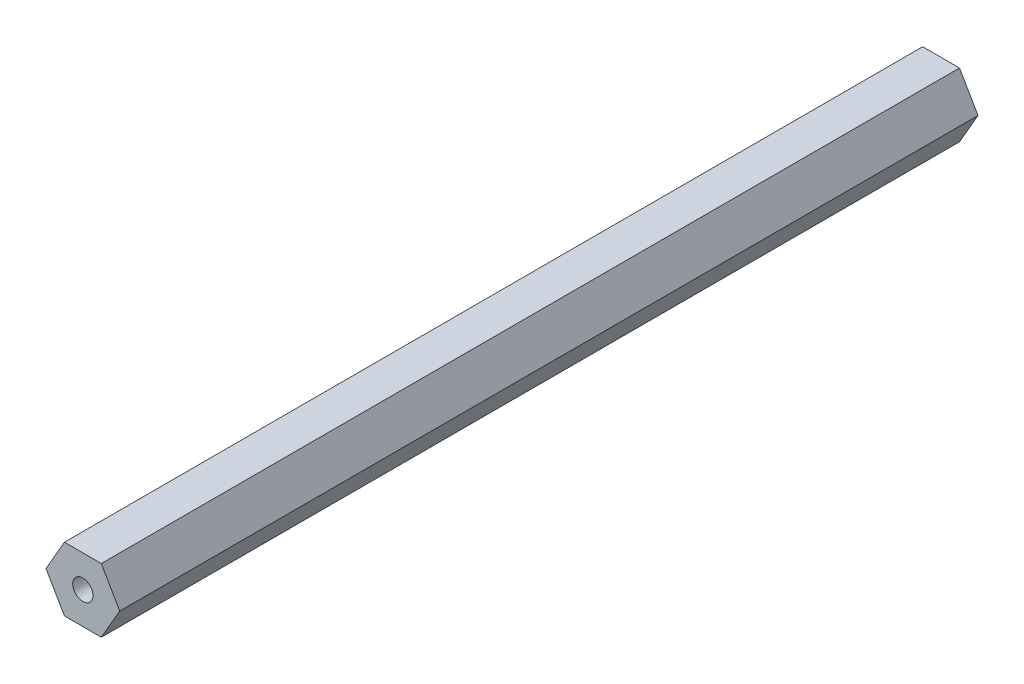
ISO-10303-21;
HEADER;
FILE_DESCRIPTION(('STEP AP214'),'2;1');
FILE_NAME('part.step','',(''),(''),'','','');
FILE_SCHEMA(('AUTOMOTIVE_DESIGN { 1 0 10303 214 1 1 1 1 }'));
ENDSEC;
DATA;
#1=APPLICATION_CONTEXT('core data for automotive mechanical design processes');
#2=APPLICATION_PROTOCOL_DEFINITION('international standard','automotive_design',2000,#1);
#3=PRODUCT_CONTEXT('',#1,'mechanical');
#4=PRODUCT('Part','Part','',(#3));
#5=PRODUCT_RELATED_PRODUCT_CATEGORY('part','',(#4));
#6=PRODUCT_DEFINITION_FORMATION('','',#4);
#7=PRODUCT_DEFINITION_CONTEXT('part definition',#1,'design');
#8=PRODUCT_DEFINITION('design','',#6,#7);
#9=PRODUCT_DEFINITION_SHAPE('','',#8);
#10=(LENGTH_UNIT() NAMED_UNIT(*) SI_UNIT(.MILLI.,.METRE.));
#11=(NAMED_UNIT(*) PLANE_ANGLE_UNIT() SI_UNIT($,.RADIAN.));
#12=(NAMED_UNIT(*) SI_UNIT($,.STERADIAN.) SOLID_ANGLE_UNIT());
#13=UNCERTAINTY_MEASURE_WITH_UNIT(LENGTH_MEASURE(1.E-05),#10,'distance_accuracy_value','');
#14=(GEOMETRIC_REPRESENTATION_CONTEXT(3) GLOBAL_UNCERTAINTY_ASSIGNED_CONTEXT((#13)) GLOBAL_UNIT_ASSIGNED_CONTEXT((#10,
#11,#12)) REPRESENTATION_CONTEXT('',''));
#15=CARTESIAN_POINT('',(0.,0.,0.));
#16=DIRECTION('',(0.,0.,1.));
#17=DIRECTION('',(1.,0.,0.));
#18=AXIS2_PLACEMENT_3D('',#15,#16,#17);
#19=CARTESIAN_POINT('',(0.,0.,170.65625));
#20=DIRECTION('',(0.,0.,1.));
#21=DIRECTION('',(1.,0.,0.));
#22=AXIS2_PLACEMENT_3D('',#19,#20,#21);
#23=PLANE('',#22);
#24=DIRECTION('',(0.5,0.866025403784439,0.));
#25=VECTOR('',#24,1.);
#26=CARTESIAN_POINT('',(3.66617420935412,-6.35,170.65625));
#27=LINE('',#26,#25);
#28=CARTESIAN_POINT('',(3.66617420935412,-6.35,170.65625));
#29=VERTEX_POINT('',#28);
#30=CARTESIAN_POINT('',(7.33234841870825,0.,170.65625));
#31=VERTEX_POINT('',#30);
#32=EDGE_CURVE('E130',#29,#31,#27,.T.);
#33=ORIENTED_EDGE('',*,*,#32,.T.);
#34=DIRECTION('',(-0.5,0.866025403784439,0.));
#35=VECTOR('',#34,1.);
#36=CARTESIAN_POINT('',(7.33234841870825,0.,170.65625));
#37=LINE('',#36,#35);
#38=CARTESIAN_POINT('',(3.66617420935412,6.35,170.65625));
#39=VERTEX_POINT('',#38);
#40=EDGE_CURVE('E88',#31,#39,#37,.T.);
#41=ORIENTED_EDGE('',*,*,#40,.T.);
#42=DIRECTION('',(-1.,0.,0.));
#43=VECTOR('',#42,1.);
#44=CARTESIAN_POINT('',(3.66617420935412,6.35,170.65625));
#45=LINE('',#44,#43);
#46=CARTESIAN_POINT('',(-3.66617420935412,6.35,170.65625));
#47=VERTEX_POINT('',#46);
#48=EDGE_CURVE('E101',#39,#47,#45,.T.);
#49=ORIENTED_EDGE('',*,*,#48,.T.);
#50=DIRECTION('',(-0.5,-0.866025403784439,0.));
#51=VECTOR('',#50,1.);
#52=CARTESIAN_POINT('',(-3.66617420935412,6.35,170.65625));
#53=LINE('',#52,#51);
#54=CARTESIAN_POINT('',(-7.33234841870824,0.,170.65625));
#55=VERTEX_POINT('',#54);
#56=EDGE_CURVE('E95',#47,#55,#53,.T.);
#57=ORIENTED_EDGE('',*,*,#56,.T.);
#58=DIRECTION('',(0.5,-0.866025403784439,0.));
#59=VECTOR('',#58,1.);
#60=CARTESIAN_POINT('',(-7.33234841870824,0.,170.65625));
#61=LINE('',#60,#59);
#62=CARTESIAN_POINT('',(-3.66617420935412,-6.35,170.65625));
#63=VERTEX_POINT('',#62);
#64=EDGE_CURVE('E99',#55,#63,#61,.T.);
#65=ORIENTED_EDGE('',*,*,#64,.T.);
#66=DIRECTION('',(1.,0.,0.));
#67=VECTOR('',#66,1.);
#68=CARTESIAN_POINT('',(-3.66617420935412,-6.35,170.65625));
#69=LINE('',#68,#67);
#70=EDGE_CURVE('E51',#63,#29,#69,.T.);
#71=ORIENTED_EDGE('',*,*,#70,.T.);
#72=EDGE_LOOP('',(#33,#41,#49,#57,#65,#71));
#73=FACE_BOUND('',#72,.T.);
#74=CARTESIAN_POINT('',(0.,0.,170.65625));
#75=DIRECTION('',(0.,0.,1.));
#76=DIRECTION('',(1.,0.,0.));
#77=AXIS2_PLACEMENT_3D('',#74,#75,#76);
#78=CIRCLE('',#77,2.0193);
#79=CARTESIAN_POINT('',(2.0193,0.,170.65625));
#80=VERTEX_POINT('',#79);
#81=EDGE_CURVE('E123',#80,#80,#78,.T.);
#82=ORIENTED_EDGE('',*,*,#81,.F.);
#83=EDGE_LOOP('',(#82));
#84=FACE_BOUND('',#83,.T.);
#85=ADVANCED_FACE('F34',(#73,#84),#23,.T.);
#86=CARTESIAN_POINT('',(0.,0.,0.));
#87=DIRECTION('',(0.,0.,1.));
#88=DIRECTION('',(1.,0.,0.));
#89=AXIS2_PLACEMENT_3D('',#86,#87,#88);
#90=PLANE('',#89);
#91=DIRECTION('',(0.5,0.866025403784439,0.));
#92=VECTOR('',#91,1.);
#93=CARTESIAN_POINT('',(3.66617420935412,-6.35,0.));
#94=LINE('',#93,#92);
#95=CARTESIAN_POINT('',(3.66617420935412,-6.35,0.));
#96=VERTEX_POINT('',#95);
#97=CARTESIAN_POINT('',(7.33234841870825,0.,0.));
#98=VERTEX_POINT('',#97);
#99=EDGE_CURVE('E119',#96,#98,#94,.T.);
#100=ORIENTED_EDGE('',*,*,#99,.F.);
#101=DIRECTION('',(1.,0.,0.));
#102=VECTOR('',#101,1.);
#103=CARTESIAN_POINT('',(-3.66617420935412,-6.35,0.));
#104=LINE('',#103,#102);
#105=CARTESIAN_POINT('',(-3.66617420935412,-6.35,0.));
#106=VERTEX_POINT('',#105);
#107=EDGE_CURVE('E80',#106,#96,#104,.T.);
#108=ORIENTED_EDGE('',*,*,#107,.F.);
#109=DIRECTION('',(0.5,-0.866025403784439,0.));
#110=VECTOR('',#109,1.);
#111=CARTESIAN_POINT('',(-7.33234841870824,0.,0.));
#112=LINE('',#111,#110);
#113=CARTESIAN_POINT('',(-7.33234841870824,0.,0.));
#114=VERTEX_POINT('',#113);
#115=EDGE_CURVE('E74',#114,#106,#112,.T.);
#116=ORIENTED_EDGE('',*,*,#115,.F.);
#117=DIRECTION('',(-0.5,-0.866025403784439,0.));
#118=VECTOR('',#117,1.);
#119=CARTESIAN_POINT('',(-3.66617420935412,6.35,0.));
#120=LINE('',#119,#118);
#121=CARTESIAN_POINT('',(-3.66617420935412,6.35,0.));
#122=VERTEX_POINT('',#121);
#123=EDGE_CURVE('E109',#122,#114,#120,.T.);
#124=ORIENTED_EDGE('',*,*,#123,.F.);
#125=DIRECTION('',(-1.,0.,0.));
#126=VECTOR('',#125,1.);
#127=CARTESIAN_POINT('',(3.66617420935412,6.35,0.));
#128=LINE('',#127,#126);
#129=CARTESIAN_POINT('',(3.66617420935412,6.35,0.));
#130=VERTEX_POINT('',#129);
#131=EDGE_CURVE('E125',#130,#122,#128,.T.);
#132=ORIENTED_EDGE('',*,*,#131,.F.);
#133=DIRECTION('',(-0.5,0.866025403784439,0.));
#134=VECTOR('',#133,1.);
#135=CARTESIAN_POINT('',(7.33234841870825,0.,0.));
#136=LINE('',#135,#134);
#137=EDGE_CURVE('E122',#98,#130,#136,.T.);
#138=ORIENTED_EDGE('',*,*,#137,.F.);
#139=EDGE_LOOP('',(#100,#108,#116,#124,#132,#138));
#140=FACE_BOUND('',#139,.T.);
#141=CARTESIAN_POINT('',(0.,0.,0.));
#142=DIRECTION('',(0.,0.,1.));
#143=DIRECTION('',(1.,0.,0.));
#144=AXIS2_PLACEMENT_3D('',#141,#142,#143);
#145=CIRCLE('',#144,2.0193);
#146=CARTESIAN_POINT('',(2.0193,0.,0.));
#147=VERTEX_POINT('',#146);
#148=EDGE_CURVE('E223',#147,#147,#145,.T.);
#149=ORIENTED_EDGE('',*,*,#148,.T.);
#150=EDGE_LOOP('',(#149));
#151=FACE_BOUND('',#150,.T.);
#152=ADVANCED_FACE('F139',(#140,#151),#90,.F.);
#153=CARTESIAN_POINT('',(3.66617420935412,-6.35,170.65625));
#154=DIRECTION('',(-0.866025403784439,0.5,0.));
#155=DIRECTION('',(-0.5,-0.866025403784439,0.));
#156=AXIS2_PLACEMENT_3D('',#153,#154,#155);
#157=PLANE('',#156);
#158=ORIENTED_EDGE('',*,*,#99,.T.);
#159=DIRECTION('',(0.,0.,-1.));
#160=VECTOR('',#159,1.);
#161=CARTESIAN_POINT('',(7.33234841870825,0.,170.65625));
#162=LINE('',#161,#160);
#163=EDGE_CURVE('E11',#31,#98,#162,.T.);
#164=ORIENTED_EDGE('',*,*,#163,.F.);
#165=ORIENTED_EDGE('',*,*,#32,.F.);
#166=DIRECTION('',(0.,0.,-1.));
#167=VECTOR('',#166,1.);
#168=CARTESIAN_POINT('',(3.66617420935412,-6.35,170.65625));
#169=LINE('',#168,#167);
#170=EDGE_CURVE('E115',#29,#96,#169,.T.);
#171=ORIENTED_EDGE('',*,*,#170,.T.);
#172=EDGE_LOOP('',(#158,#164,#165,#171));
#173=FACE_BOUND('',#172,.T.);
#174=ADVANCED_FACE('F36',(#173),#157,.F.);
#175=CARTESIAN_POINT('',(7.33234841870825,0.,170.65625));
#176=DIRECTION('',(-0.866025403784439,-0.5,0.));
#177=DIRECTION('',(0.5,-0.866025403784439,0.));
#178=AXIS2_PLACEMENT_3D('',#175,#176,#177);
#179=PLANE('',#178);
#180=ORIENTED_EDGE('',*,*,#137,.T.);
#181=DIRECTION('',(0.,0.,-1.));
#182=VECTOR('',#181,1.);
#183=CARTESIAN_POINT('',(3.66617420935412,6.35,170.65625));
#184=LINE('',#183,#182);
#185=EDGE_CURVE('E43',#39,#130,#184,.T.);
#186=ORIENTED_EDGE('',*,*,#185,.F.);
#187=ORIENTED_EDGE('',*,*,#40,.F.);
#188=ORIENTED_EDGE('',*,*,#163,.T.);
#189=EDGE_LOOP('',(#180,#186,#187,#188));
#190=FACE_BOUND('',#189,.T.);
#191=ADVANCED_FACE('F164',(#190),#179,.F.);
#192=CARTESIAN_POINT('',(3.66617420935412,6.35,170.65625));
#193=DIRECTION('',(0.,-1.,0.));
#194=DIRECTION('',(0.,0.,-1.));
#195=AXIS2_PLACEMENT_3D('',#192,#193,#194);
#196=PLANE('',#195);
#197=ORIENTED_EDGE('',*,*,#131,.T.);
#198=DIRECTION('',(0.,0.,-1.));
#199=VECTOR('',#198,1.);
#200=CARTESIAN_POINT('',(-3.66617420935412,6.35,170.65625));
#201=LINE('',#200,#199);
#202=EDGE_CURVE('E110',#47,#122,#201,.T.);
#203=ORIENTED_EDGE('',*,*,#202,.F.);
#204=ORIENTED_EDGE('',*,*,#48,.F.);
#205=ORIENTED_EDGE('',*,*,#185,.T.);
#206=EDGE_LOOP('',(#197,#203,#204,#205));
#207=FACE_BOUND('',#206,.T.);
#208=ADVANCED_FACE('F136',(#207),#196,.F.);
#209=CARTESIAN_POINT('',(-3.66617420935412,6.35,170.65625));
#210=DIRECTION('',(0.866025403784439,-0.5,0.));
#211=DIRECTION('',(0.5,0.866025403784439,0.));
#212=AXIS2_PLACEMENT_3D('',#209,#210,#211);
#213=PLANE('',#212);
#214=ORIENTED_EDGE('',*,*,#123,.T.);
#215=DIRECTION('',(0.,0.,-1.));
#216=VECTOR('',#215,1.);
#217=CARTESIAN_POINT('',(-7.33234841870824,0.,170.65625));
#218=LINE('',#217,#216);
#219=EDGE_CURVE('E106',#55,#114,#218,.T.);
#220=ORIENTED_EDGE('',*,*,#219,.F.);
#221=ORIENTED_EDGE('',*,*,#56,.F.);
#222=ORIENTED_EDGE('',*,*,#202,.T.);
#223=EDGE_LOOP('',(#214,#220,#221,#222));
#224=FACE_BOUND('',#223,.T.);
#225=ADVANCED_FACE('F107',(#224),#213,.F.);
#226=CARTESIAN_POINT('',(-7.33234841870824,0.,170.65625));
#227=DIRECTION('',(0.866025403784439,0.5,0.));
#228=DIRECTION('',(-0.5,0.866025403784439,0.));
#229=AXIS2_PLACEMENT_3D('',#226,#227,#228);
#230=PLANE('',#229);
#231=ORIENTED_EDGE('',*,*,#115,.T.);
#232=DIRECTION('',(0.,0.,-1.));
#233=VECTOR('',#232,1.);
#234=CARTESIAN_POINT('',(-3.66617420935412,-6.35,170.65625));
#235=LINE('',#234,#233);
#236=EDGE_CURVE('E111',#63,#106,#235,.T.);
#237=ORIENTED_EDGE('',*,*,#236,.F.);
#238=ORIENTED_EDGE('',*,*,#64,.F.);
#239=ORIENTED_EDGE('',*,*,#219,.T.);
#240=EDGE_LOOP('',(#231,#237,#238,#239));
#241=FACE_BOUND('',#240,.T.);
#242=ADVANCED_FACE('F113',(#241),#230,.F.);
#243=CARTESIAN_POINT('',(-3.66617420935412,-6.35,170.65625));
#244=DIRECTION('',(0.,1.,0.));
#245=DIRECTION('',(0.,0.,1.));
#246=AXIS2_PLACEMENT_3D('',#243,#244,#245);
#247=PLANE('',#246);
#248=ORIENTED_EDGE('',*,*,#107,.T.);
#249=ORIENTED_EDGE('',*,*,#170,.F.);
#250=ORIENTED_EDGE('',*,*,#70,.F.);
#251=ORIENTED_EDGE('',*,*,#236,.T.);
#252=EDGE_LOOP('',(#248,#249,#250,#251));
#253=FACE_BOUND('',#252,.T.);
#254=ADVANCED_FACE('F144',(#253),#247,.F.);
#255=CARTESIAN_POINT('',(0.,0.,170.65625));
#256=DIRECTION('',(0.,0.,-1.));
#257=DIRECTION('',(-1.,0.,0.));
#258=AXIS2_PLACEMENT_3D('',#255,#256,#257);
#259=CYLINDRICAL_SURFACE('',#258,2.0193);
#260=ORIENTED_EDGE('',*,*,#81,.T.);
#261=EDGE_LOOP('',(#260));
#262=FACE_BOUND('',#261,.T.);
#263=ORIENTED_EDGE('',*,*,#148,.F.);
#264=EDGE_LOOP('',(#263));
#265=FACE_BOUND('',#264,.T.);
#266=ADVANCED_FACE('F146',(#262,#265),#259,.F.);
#267=CLOSED_SHELL('',(#85,#152,#174,#191,#208,#225,#242,#254,#266));
#268=MANIFOLD_SOLID_BREP('B2',#267);
#269=ADVANCED_BREP_SHAPE_REPRESENTATION('',(#18,#268),#14);
#270=SHAPE_DEFINITION_REPRESENTATION(#9,#269);
ENDSEC;
END-ISO-10303-21;
